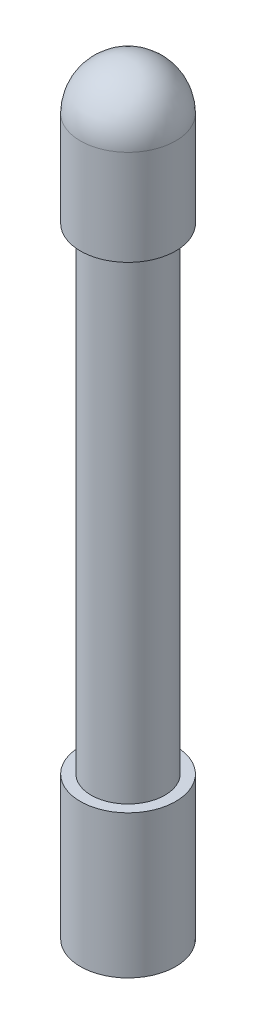
ISO-10303-21;
HEADER;
FILE_DESCRIPTION(('STEP AP214'),'2;1');
FILE_NAME('part.step','',(''),(''),'','','');
FILE_SCHEMA(('AUTOMOTIVE_DESIGN { 1 0 10303 214 1 1 1 1 }'));
ENDSEC;
DATA;
#1=APPLICATION_CONTEXT('core data for automotive mechanical design processes');
#2=APPLICATION_PROTOCOL_DEFINITION('international standard','automotive_design',2000,#1);
#3=PRODUCT_CONTEXT('',#1,'mechanical');
#4=PRODUCT('Part','Part','',(#3));
#5=PRODUCT_RELATED_PRODUCT_CATEGORY('part','',(#4));
#6=PRODUCT_DEFINITION_FORMATION('','',#4);
#7=PRODUCT_DEFINITION_CONTEXT('part definition',#1,'design');
#8=PRODUCT_DEFINITION('design','',#6,#7);
#9=PRODUCT_DEFINITION_SHAPE('','',#8);
#10=(LENGTH_UNIT() NAMED_UNIT(*) SI_UNIT(.MILLI.,.METRE.));
#11=(NAMED_UNIT(*) PLANE_ANGLE_UNIT() SI_UNIT($,.RADIAN.));
#12=(NAMED_UNIT(*) SI_UNIT($,.STERADIAN.) SOLID_ANGLE_UNIT());
#13=UNCERTAINTY_MEASURE_WITH_UNIT(LENGTH_MEASURE(1.E-05),#10,'distance_accuracy_value','');
#14=(GEOMETRIC_REPRESENTATION_CONTEXT(3) GLOBAL_UNCERTAINTY_ASSIGNED_CONTEXT((#13)) GLOBAL_UNIT_ASSIGNED_CONTEXT((#10,
#11,#12)) REPRESENTATION_CONTEXT('',''));
#15=CARTESIAN_POINT('',(0.,0.,0.));
#16=DIRECTION('',(0.,0.,1.));
#17=DIRECTION('',(1.,0.,0.));
#18=AXIS2_PLACEMENT_3D('',#15,#16,#17);
#19=CARTESIAN_POINT('',(0.,7.62,0.));
#20=DIRECTION('',(0.,-1.,0.));
#21=DIRECTION('',(0.,0.,-1.));
#22=AXIS2_PLACEMENT_3D('',#19,#20,#21);
#23=CYLINDRICAL_SURFACE('',#22,2.54);
#24=CARTESIAN_POINT('',(0.,7.62,0.));
#25=DIRECTION('',(0.,1.,0.));
#26=DIRECTION('',(0.,0.,1.));
#27=AXIS2_PLACEMENT_3D('',#24,#25,#26);
#28=CIRCLE('',#27,2.54);
#29=CARTESIAN_POINT('',(0.,7.62,-2.54));
#30=VERTEX_POINT('',#29);
#31=EDGE_CURVE('E46',#30,#30,#28,.T.);
#32=CARTESIAN_POINT('',(0.,0.,0.));
#33=DIRECTION('',(0.,1.,0.));
#34=DIRECTION('',(0.,0.,1.));
#35=AXIS2_PLACEMENT_3D('',#32,#33,#34);
#36=CIRCLE('',#35,2.54);
#37=CARTESIAN_POINT('',(0.,0.,-2.54));
#38=VERTEX_POINT('',#37);
#39=EDGE_CURVE('E51',#38,#38,#36,.T.);
#40=CARTESIAN_POINT('',(0.,7.62,-2.54));
#41=CARTESIAN_POINT('',(0.,7.540625,-2.54));
#42=CARTESIAN_POINT('',(0.,7.46125,-2.54));
#43=CARTESIAN_POINT('',(0.,7.3025,-2.54));
#44=CARTESIAN_POINT('',(0.,7.223125,-2.54));
#45=CARTESIAN_POINT('',(0.,7.064375,-2.54));
#46=CARTESIAN_POINT('',(0.,6.985,-2.54));
#47=CARTESIAN_POINT('',(0.,6.82625,-2.54));
#48=CARTESIAN_POINT('',(0.,6.746875,-2.54));
#49=CARTESIAN_POINT('',(0.,6.588125,-2.54));
#50=CARTESIAN_POINT('',(0.,6.50875,-2.54));
#51=CARTESIAN_POINT('',(0.,6.35,-2.54));
#52=CARTESIAN_POINT('',(0.,6.270625,-2.54));
#53=CARTESIAN_POINT('',(0.,6.111875,-2.54));
#54=CARTESIAN_POINT('',(0.,6.0325,-2.54));
#55=CARTESIAN_POINT('',(0.,5.87375,-2.54));
#56=CARTESIAN_POINT('',(0.,5.794375,-2.54));
#57=CARTESIAN_POINT('',(0.,5.635625,-2.54));
#58=CARTESIAN_POINT('',(0.,5.55625,-2.54));
#59=CARTESIAN_POINT('',(0.,5.3975,-2.54));
#60=CARTESIAN_POINT('',(0.,5.318125,-2.54));
#61=CARTESIAN_POINT('',(0.,5.159375,-2.54));
#62=CARTESIAN_POINT('',(0.,5.08,-2.54));
#63=CARTESIAN_POINT('',(0.,4.92125,-2.54));
#64=CARTESIAN_POINT('',(0.,4.841875,-2.54));
#65=CARTESIAN_POINT('',(0.,4.683125,-2.54));
#66=CARTESIAN_POINT('',(0.,4.60375,-2.54));
#67=CARTESIAN_POINT('',(0.,4.445,-2.54));
#68=CARTESIAN_POINT('',(0.,4.365625,-2.54));
#69=CARTESIAN_POINT('',(0.,4.206875,-2.54));
#70=CARTESIAN_POINT('',(0.,4.1275,-2.54));
#71=CARTESIAN_POINT('',(0.,3.96875,-2.54));
#72=CARTESIAN_POINT('',(0.,3.889375,-2.54));
#73=CARTESIAN_POINT('',(0.,3.730625,-2.54));
#74=CARTESIAN_POINT('',(0.,3.65125,-2.54));
#75=CARTESIAN_POINT('',(0.,3.4925,-2.54));
#76=CARTESIAN_POINT('',(0.,3.413125,-2.54));
#77=CARTESIAN_POINT('',(0.,3.254375,-2.54));
#78=CARTESIAN_POINT('',(0.,3.175,-2.54));
#79=CARTESIAN_POINT('',(0.,3.01625,-2.54));
#80=CARTESIAN_POINT('',(0.,2.936875,-2.54));
#81=CARTESIAN_POINT('',(0.,2.778125,-2.54));
#82=CARTESIAN_POINT('',(0.,2.69875,-2.54));
#83=CARTESIAN_POINT('',(0.,2.54,-2.54));
#84=CARTESIAN_POINT('',(0.,2.460625,-2.54));
#85=CARTESIAN_POINT('',(0.,2.301875,-2.54));
#86=CARTESIAN_POINT('',(0.,2.2225,-2.54));
#87=CARTESIAN_POINT('',(0.,2.06375,-2.54));
#88=CARTESIAN_POINT('',(0.,1.984375,-2.54));
#89=CARTESIAN_POINT('',(0.,1.825625,-2.54));
#90=CARTESIAN_POINT('',(0.,1.74625,-2.54));
#91=CARTESIAN_POINT('',(0.,1.5875,-2.54));
#92=CARTESIAN_POINT('',(0.,1.508125,-2.54));
#93=CARTESIAN_POINT('',(0.,1.349375,-2.54));
#94=CARTESIAN_POINT('',(0.,1.27,-2.54));
#95=CARTESIAN_POINT('',(0.,1.11125,-2.54));
#96=CARTESIAN_POINT('',(0.,1.031875,-2.54));
#97=CARTESIAN_POINT('',(0.,0.873125,-2.54));
#98=CARTESIAN_POINT('',(0.,0.79375,-2.54));
#99=CARTESIAN_POINT('',(0.,0.635,-2.54));
#100=CARTESIAN_POINT('',(0.,0.555625,-2.54));
#101=CARTESIAN_POINT('',(0.,0.396875,-2.54));
#102=CARTESIAN_POINT('',(0.,0.3175,-2.54));
#103=CARTESIAN_POINT('',(0.,0.15875,-2.54));
#104=CARTESIAN_POINT('',(0.,0.0793749999999999,-2.54));
#105=CARTESIAN_POINT('',(0.,0.,-2.54));
#106=B_SPLINE_CURVE_WITH_KNOTS('',3,(#40,#41,#42,#43,#44,#45,#46,#47,#48,#49,#50,#51,#52,#53,
#54,#55,#56,#57,#58,#59,#60,#61,#62,#63,#64,#65,#66,#67,#68,#69,#70,#71,#72,#73,#74,#75,#76,#77,
#78,#79,#80,#81,#82,#83,#84,#85,#86,#87,#88,#89,#90,#91,#92,#93,#94,#95,#96,#97,#98,#99,#100,
#101,#102,#103,#104,#105),.UNSPECIFIED.,.F.,.F.,(4,2,2,2,2,2,2,2,2,2,2,2,2,2,2,2,2,2,2,2,2,2,2,
2,2,2,2,2,2,2,2,2,4),(0.,0.238125,0.47625,0.714375000000001,0.9525,1.190625,1.42875,1.666875,
1.905,2.143125,2.38125,2.619375,2.8575,3.095625,3.33375,3.571875,3.81,4.048125,4.28625,4.524375,
4.7625,5.000625,5.23875,5.476875,5.715,5.953125,6.19125,6.429375,6.6675,6.905625,7.14375,
7.381875,7.62),.UNSPECIFIED.);
#107=EDGE_CURVE('BSEAM35',#30,#38,#106,.T.);
#108=ORIENTED_EDGE('',*,*,#31,.F.);
#109=ORIENTED_EDGE('',*,*,#39,.T.);
#110=ORIENTED_EDGE('',*,*,#107,.T.);
#111=ORIENTED_EDGE('',*,*,#107,.F.);
#112=EDGE_LOOP('',(#108,#110,#109,#111));
#113=FACE_BOUND('',#112,.T.);
#114=ADVANCED_FACE('F35',(#113),#23,.T.);
#115=CARTESIAN_POINT('',(0.,7.62,0.));
#116=DIRECTION('',(0.,1.,0.));
#117=DIRECTION('',(0.,0.,1.));
#118=AXIS2_PLACEMENT_3D('',#115,#116,#117);
#119=PLANE('',#118);
#120=CARTESIAN_POINT('',(0.,7.62,0.));
#121=DIRECTION('',(0.,1.,0.));
#122=DIRECTION('',(0.,0.,1.));
#123=AXIS2_PLACEMENT_3D('',#120,#121,#122);
#124=CIRCLE('',#123,1.96502869325319);
#125=CARTESIAN_POINT('',(0.,7.62,1.96502869325319));
#126=VERTEX_POINT('',#125);
#127=EDGE_CURVE('E42',#126,#126,#124,.T.);
#128=ORIENTED_EDGE('',*,*,#127,.F.);
#129=EDGE_LOOP('',(#128));
#130=FACE_BOUND('',#129,.T.);
#131=ORIENTED_EDGE('',*,*,#31,.T.);
#132=EDGE_LOOP('',(#131));
#133=FACE_BOUND('',#132,.T.);
#134=ADVANCED_FACE('F79',(#130,#133),#119,.T.);
#135=CARTESIAN_POINT('',(0.,0.,0.));
#136=DIRECTION('',(0.,1.,0.));
#137=DIRECTION('',(0.,0.,1.));
#138=AXIS2_PLACEMENT_3D('',#135,#136,#137);
#139=PLANE('',#138);
#140=ORIENTED_EDGE('',*,*,#39,.F.);
#141=EDGE_LOOP('',(#140));
#142=FACE_BOUND('',#141,.T.);
#143=ADVANCED_FACE('F84',(#142),#139,.F.);
#144=CARTESIAN_POINT('',(0.,33.02,0.));
#145=DIRECTION('',(0.,-1.,0.));
#146=DIRECTION('',(0.,0.,-1.));
#147=AXIS2_PLACEMENT_3D('',#144,#145,#146);
#148=CYLINDRICAL_SURFACE('',#147,1.96502869325319);
#149=CARTESIAN_POINT('',(0.,33.02,0.));
#150=DIRECTION('',(0.,1.,0.));
#151=DIRECTION('',(0.,0.,1.));
#152=AXIS2_PLACEMENT_3D('',#149,#150,#151);
#153=CIRCLE('',#152,1.96502869325319);
#154=CARTESIAN_POINT('',(0.,33.02,1.96502869325319));
#155=VERTEX_POINT('',#154);
#156=EDGE_CURVE('E54',#155,#155,#153,.T.);
#157=ORIENTED_EDGE('',*,*,#156,.F.);
#158=EDGE_LOOP('',(#157));
#159=FACE_BOUND('',#158,.T.);
#160=ORIENTED_EDGE('',*,*,#127,.T.);
#161=EDGE_LOOP('',(#160));
#162=FACE_BOUND('',#161,.T.);
#163=ADVANCED_FACE('F76',(#159,#162),#148,.T.);
#164=CARTESIAN_POINT('',(0.,40.64,0.));
#165=DIRECTION('',(0.,-1.,0.));
#166=DIRECTION('',(0.,0.,-1.));
#167=AXIS2_PLACEMENT_3D('',#164,#165,#166);
#168=CYLINDRICAL_SURFACE('',#167,2.54);
#169=CARTESIAN_POINT('',(0.,38.1,0.));
#170=DIRECTION('',(0.,-1.,0.));
#171=DIRECTION('',(0.,0.,-1.));
#172=AXIS2_PLACEMENT_3D('',#169,#170,#171);
#173=CIRCLE('',#172,2.54);
#174=CARTESIAN_POINT('',(0.,38.1,-2.54));
#175=VERTEX_POINT('',#174);
#176=EDGE_CURVE('E10',#175,#175,#173,.T.);
#177=CARTESIAN_POINT('',(0.,33.02,0.));
#178=DIRECTION('',(0.,1.,0.));
#179=DIRECTION('',(0.,0.,1.));
#180=AXIS2_PLACEMENT_3D('',#177,#178,#179);
#181=CIRCLE('',#180,2.54);
#182=CARTESIAN_POINT('',(0.,33.02,-2.54));
#183=VERTEX_POINT('',#182);
#184=EDGE_CURVE('E60',#183,#183,#181,.T.);
#185=CARTESIAN_POINT('',(0.,38.1,-2.54));
#186=CARTESIAN_POINT('',(0.,38.0470833333333,-2.54));
#187=CARTESIAN_POINT('',(0.,37.9941666666667,-2.54));
#188=CARTESIAN_POINT('',(0.,37.8883333333333,-2.54));
#189=CARTESIAN_POINT('',(0.,37.8354166666667,-2.54));
#190=CARTESIAN_POINT('',(0.,37.7295833333333,-2.54));
#191=CARTESIAN_POINT('',(0.,37.6766666666667,-2.54));
#192=CARTESIAN_POINT('',(0.,37.5708333333333,-2.54));
#193=CARTESIAN_POINT('',(0.,37.5179166666667,-2.54));
#194=CARTESIAN_POINT('',(0.,37.4120833333333,-2.54));
#195=CARTESIAN_POINT('',(0.,37.3591666666667,-2.54));
#196=CARTESIAN_POINT('',(0.,37.2533333333333,-2.54));
#197=CARTESIAN_POINT('',(0.,37.2004166666667,-2.54));
#198=CARTESIAN_POINT('',(0.,37.0945833333333,-2.54));
#199=CARTESIAN_POINT('',(0.,37.0416666666667,-2.54));
#200=CARTESIAN_POINT('',(0.,36.9358333333333,-2.54));
#201=CARTESIAN_POINT('',(0.,36.8829166666667,-2.54));
#202=CARTESIAN_POINT('',(0.,36.7770833333333,-2.54));
#203=CARTESIAN_POINT('',(0.,36.7241666666667,-2.54));
#204=CARTESIAN_POINT('',(0.,36.6183333333333,-2.54));
#205=CARTESIAN_POINT('',(0.,36.5654166666667,-2.54));
#206=CARTESIAN_POINT('',(0.,36.4595833333333,-2.54));
#207=CARTESIAN_POINT('',(0.,36.4066666666667,-2.54));
#208=CARTESIAN_POINT('',(0.,36.3008333333333,-2.54));
#209=CARTESIAN_POINT('',(0.,36.2479166666667,-2.54));
#210=CARTESIAN_POINT('',(0.,36.1420833333333,-2.54));
#211=CARTESIAN_POINT('',(0.,36.0891666666667,-2.54));
#212=CARTESIAN_POINT('',(0.,35.9833333333333,-2.54));
#213=CARTESIAN_POINT('',(0.,35.9304166666667,-2.54));
#214=CARTESIAN_POINT('',(0.,35.8245833333333,-2.54));
#215=CARTESIAN_POINT('',(0.,35.7716666666667,-2.54));
#216=CARTESIAN_POINT('',(0.,35.6658333333333,-2.54));
#217=CARTESIAN_POINT('',(0.,35.6129166666667,-2.54));
#218=CARTESIAN_POINT('',(0.,35.5070833333333,-2.54));
#219=CARTESIAN_POINT('',(0.,35.4541666666667,-2.54));
#220=CARTESIAN_POINT('',(0.,35.3483333333333,-2.54));
#221=CARTESIAN_POINT('',(0.,35.2954166666667,-2.54));
#222=CARTESIAN_POINT('',(0.,35.1895833333333,-2.54));
#223=CARTESIAN_POINT('',(0.,35.1366666666667,-2.54));
#224=CARTESIAN_POINT('',(0.,35.0308333333333,-2.54));
#225=CARTESIAN_POINT('',(0.,34.9779166666667,-2.54));
#226=CARTESIAN_POINT('',(0.,34.8720833333333,-2.54));
#227=CARTESIAN_POINT('',(0.,34.8191666666667,-2.54));
#228=CARTESIAN_POINT('',(0.,34.7133333333333,-2.54));
#229=CARTESIAN_POINT('',(0.,34.6604166666667,-2.54));
#230=CARTESIAN_POINT('',(0.,34.5545833333333,-2.54));
#231=CARTESIAN_POINT('',(0.,34.5016666666667,-2.54));
#232=CARTESIAN_POINT('',(0.,34.3958333333333,-2.54));
#233=CARTESIAN_POINT('',(0.,34.3429166666667,-2.54));
#234=CARTESIAN_POINT('',(0.,34.2370833333333,-2.54));
#235=CARTESIAN_POINT('',(0.,34.1841666666667,-2.54));
#236=CARTESIAN_POINT('',(0.,34.0783333333333,-2.54));
#237=CARTESIAN_POINT('',(0.,34.0254166666667,-2.54));
#238=CARTESIAN_POINT('',(0.,33.9195833333333,-2.54));
#239=CARTESIAN_POINT('',(0.,33.8666666666667,-2.54));
#240=CARTESIAN_POINT('',(0.,33.7608333333333,-2.54));
#241=CARTESIAN_POINT('',(0.,33.7079166666667,-2.54));
#242=CARTESIAN_POINT('',(0.,33.6020833333333,-2.54));
#243=CARTESIAN_POINT('',(0.,33.5491666666667,-2.54));
#244=CARTESIAN_POINT('',(0.,33.4433333333333,-2.54));
#245=CARTESIAN_POINT('',(0.,33.3904166666667,-2.54));
#246=CARTESIAN_POINT('',(0.,33.2845833333333,-2.54));
#247=CARTESIAN_POINT('',(0.,33.2316666666667,-2.54));
#248=CARTESIAN_POINT('',(0.,33.1258333333333,-2.54));
#249=CARTESIAN_POINT('',(0.,33.0729166666667,-2.54));
#250=CARTESIAN_POINT('',(0.,33.02,-2.54));
#251=B_SPLINE_CURVE_WITH_KNOTS('',3,(#185,#186,#187,#188,#189,#190,#191,#192,#193,#194,#195,
#196,#197,#198,#199,#200,#201,#202,#203,#204,#205,#206,#207,#208,#209,#210,#211,#212,#213,#214,
#215,#216,#217,#218,#219,#220,#221,#222,#223,#224,#225,#226,#227,#228,#229,#230,#231,#232,#233,
#234,#235,#236,#237,#238,#239,#240,#241,#242,#243,#244,#245,#246,#247,#248,#249,#250),
.UNSPECIFIED.,.F.,.F.,(4,2,2,2,2,2,2,2,2,2,2,2,2,2,2,2,2,2,2,2,2,2,2,2,2,2,2,2,2,2,2,2,4),(0.,
0.158749999999999,0.317499999999998,0.476249999999998,0.634999999999997,0.793749999999996,
0.952499999999995,1.11125,1.27,1.42875,1.5875,1.74625,1.905,2.06375,2.2225,2.38125,2.54,2.69875,
2.8575,3.01625,3.175,3.33375,3.4925,3.65125,3.81,3.96875,4.1275,4.28625000000001,4.445,4.60375,
4.7625,4.92125,5.08),.UNSPECIFIED.);
#252=EDGE_CURVE('BSEAM66',#175,#183,#251,.T.);
#253=ORIENTED_EDGE('',*,*,#176,.T.);
#254=ORIENTED_EDGE('',*,*,#184,.T.);
#255=ORIENTED_EDGE('',*,*,#252,.T.);
#256=ORIENTED_EDGE('',*,*,#252,.F.);
#257=EDGE_LOOP('',(#253,#255,#254,#256));
#258=FACE_BOUND('',#257,.T.);
#259=ADVANCED_FACE('F66',(#258),#168,.T.);
#260=CARTESIAN_POINT('',(0.,33.02,0.));
#261=DIRECTION('',(0.,1.,0.));
#262=DIRECTION('',(0.,0.,1.));
#263=AXIS2_PLACEMENT_3D('',#260,#261,#262);
#264=PLANE('',#263);
#265=ORIENTED_EDGE('',*,*,#156,.T.);
#266=EDGE_LOOP('',(#265));
#267=FACE_BOUND('',#266,.T.);
#268=ORIENTED_EDGE('',*,*,#184,.F.);
#269=EDGE_LOOP('',(#268));
#270=FACE_BOUND('',#269,.T.);
#271=ADVANCED_FACE('F68',(#267,#270),#264,.F.);
#272=CARTESIAN_POINT('',(0.,38.1,0.));
#273=DIRECTION('',(0.,1.,0.));
#274=DIRECTION('',(0.,0.,1.));
#275=AXIS2_PLACEMENT_3D('',#272,#273,#274);
#276=SPHERICAL_SURFACE('',#275,2.54);
#277=ORIENTED_EDGE('',*,*,#176,.F.);
#278=EDGE_LOOP('',(#277));
#279=FACE_BOUND('',#278,.T.);
#280=ADVANCED_FACE('F37',(#279),#276,.T.);
#281=CLOSED_SHELL('',(#114,#134,#143,#163,#259,#271,#280));
#282=MANIFOLD_SOLID_BREP('B2',#281);
#283=ADVANCED_BREP_SHAPE_REPRESENTATION('',(#18,#282),#14);
#284=SHAPE_DEFINITION_REPRESENTATION(#9,#283);
ENDSEC;
END-ISO-10303-21;
